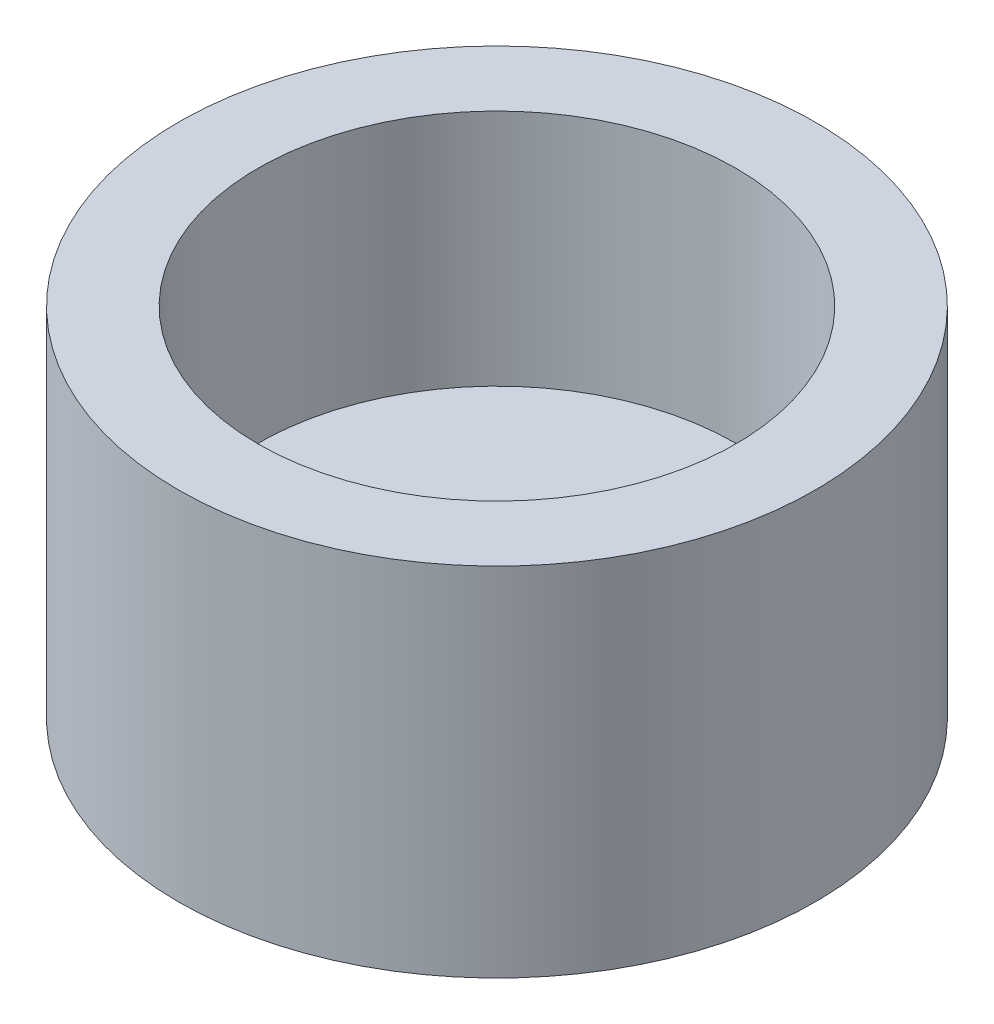
ISO-10303-21;
HEADER;
FILE_DESCRIPTION(('STEP AP214'),'2;1');
FILE_NAME('part.step','',(''),(''),'','','');
FILE_SCHEMA(('AUTOMOTIVE_DESIGN { 1 0 10303 214 1 1 1 1 }'));
ENDSEC;
DATA;
#1=APPLICATION_CONTEXT('core data for automotive mechanical design processes');
#2=APPLICATION_PROTOCOL_DEFINITION('international standard','automotive_design',2000,#1);
#3=PRODUCT_CONTEXT('',#1,'mechanical');
#4=PRODUCT('Part','Part','',(#3));
#5=PRODUCT_RELATED_PRODUCT_CATEGORY('part','',(#4));
#6=PRODUCT_DEFINITION_FORMATION('','',#4);
#7=PRODUCT_DEFINITION_CONTEXT('part definition',#1,'design');
#8=PRODUCT_DEFINITION('design','',#6,#7);
#9=PRODUCT_DEFINITION_SHAPE('','',#8);
#10=(LENGTH_UNIT() NAMED_UNIT(*) SI_UNIT(.MILLI.,.METRE.));
#11=(NAMED_UNIT(*) PLANE_ANGLE_UNIT() SI_UNIT($,.RADIAN.));
#12=(NAMED_UNIT(*) SI_UNIT($,.STERADIAN.) SOLID_ANGLE_UNIT());
#13=UNCERTAINTY_MEASURE_WITH_UNIT(LENGTH_MEASURE(1.E-05),#10,'distance_accuracy_value','');
#14=(GEOMETRIC_REPRESENTATION_CONTEXT(3) GLOBAL_UNCERTAINTY_ASSIGNED_CONTEXT((#13)) GLOBAL_UNIT_ASSIGNED_CONTEXT((#10,
#11,#12)) REPRESENTATION_CONTEXT('',''));
#15=CARTESIAN_POINT('',(0.,0.,0.));
#16=DIRECTION('',(0.,0.,1.));
#17=DIRECTION('',(1.,0.,0.));
#18=AXIS2_PLACEMENT_3D('',#15,#16,#17);
#19=CARTESIAN_POINT('',(0.,28.45,0.));
#20=DIRECTION('',(0.,-1.,0.));
#21=DIRECTION('',(0.,0.,-1.));
#22=AXIS2_PLACEMENT_3D('',#19,#20,#21);
#23=CYLINDRICAL_SURFACE('',#22,25.4);
#24=CARTESIAN_POINT('',(0.,28.45,0.));
#25=DIRECTION('',(0.,1.,0.));
#26=DIRECTION('',(0.,0.,1.));
#27=AXIS2_PLACEMENT_3D('',#24,#25,#26);
#28=CIRCLE('',#27,25.4);
#29=CARTESIAN_POINT('',(0.,28.45,25.4));
#30=VERTEX_POINT('',#29);
#31=EDGE_CURVE('E10',#30,#30,#28,.T.);
#32=ORIENTED_EDGE('',*,*,#31,.F.);
#33=EDGE_LOOP('',(#32));
#34=FACE_BOUND('',#33,.T.);
#35=CARTESIAN_POINT('',(0.,0.,0.));
#36=DIRECTION('',(0.,1.,0.));
#37=DIRECTION('',(0.,0.,1.));
#38=AXIS2_PLACEMENT_3D('',#35,#36,#37);
#39=CIRCLE('',#38,25.4);
#40=CARTESIAN_POINT('',(0.,0.,25.4));
#41=VERTEX_POINT('',#40);
#42=EDGE_CURVE('E40',#41,#41,#39,.T.);
#43=ORIENTED_EDGE('',*,*,#42,.T.);
#44=EDGE_LOOP('',(#43));
#45=FACE_BOUND('',#44,.T.);
#46=ADVANCED_FACE('F37',(#34,#45),#23,.T.);
#47=CARTESIAN_POINT('',(0.,28.45,0.));
#48=DIRECTION('',(0.,1.,0.));
#49=DIRECTION('',(0.,0.,1.));
#50=AXIS2_PLACEMENT_3D('',#47,#48,#49);
#51=PLANE('',#50);
#52=CARTESIAN_POINT('',(0.,28.45,0.));
#53=DIRECTION('',(0.,1.,0.));
#54=DIRECTION('',(0.,0.,1.));
#55=AXIS2_PLACEMENT_3D('',#52,#53,#54);
#56=CIRCLE('',#55,19.05);
#57=CARTESIAN_POINT('',(0.,28.45,19.05));
#58=VERTEX_POINT('',#57);
#59=EDGE_CURVE('E51',#58,#58,#56,.T.);
#60=ORIENTED_EDGE('',*,*,#59,.F.);
#61=EDGE_LOOP('',(#60));
#62=FACE_BOUND('',#61,.T.);
#63=ORIENTED_EDGE('',*,*,#31,.T.);
#64=EDGE_LOOP('',(#63));
#65=FACE_BOUND('',#64,.T.);
#66=ADVANCED_FACE('F68',(#62,#65),#51,.T.);
#67=CARTESIAN_POINT('',(0.,0.,0.));
#68=DIRECTION('',(0.,1.,0.));
#69=DIRECTION('',(0.,0.,1.));
#70=AXIS2_PLACEMENT_3D('',#67,#68,#69);
#71=PLANE('',#70);
#72=ORIENTED_EDGE('',*,*,#42,.F.);
#73=EDGE_LOOP('',(#72));
#74=FACE_BOUND('',#73,.T.);
#75=ADVANCED_FACE('F64',(#74),#71,.F.);
#76=CARTESIAN_POINT('',(0.,9.45,0.));
#77=DIRECTION('',(0.,1.,0.));
#78=DIRECTION('',(0.,0.,1.));
#79=AXIS2_PLACEMENT_3D('',#76,#77,#78);
#80=CYLINDRICAL_SURFACE('',#79,19.05);
#81=CARTESIAN_POINT('',(0.,9.45,0.));
#82=DIRECTION('',(0.,1.,0.));
#83=DIRECTION('',(0.,0.,1.));
#84=AXIS2_PLACEMENT_3D('',#81,#82,#83);
#85=CIRCLE('',#84,19.05);
#86=CARTESIAN_POINT('',(0.,9.45,19.05));
#87=VERTEX_POINT('',#86);
#88=EDGE_CURVE('E49',#87,#87,#85,.T.);
#89=ORIENTED_EDGE('',*,*,#88,.F.);
#90=EDGE_LOOP('',(#89));
#91=FACE_BOUND('',#90,.T.);
#92=ORIENTED_EDGE('',*,*,#59,.T.);
#93=EDGE_LOOP('',(#92));
#94=FACE_BOUND('',#93,.T.);
#95=ADVANCED_FACE('F61',(#91,#94),#80,.F.);
#96=CARTESIAN_POINT('',(0.,9.45,0.));
#97=DIRECTION('',(0.,1.,0.));
#98=DIRECTION('',(0.,0.,1.));
#99=AXIS2_PLACEMENT_3D('',#96,#97,#98);
#100=PLANE('',#99);
#101=ORIENTED_EDGE('',*,*,#88,.T.);
#102=EDGE_LOOP('',(#101));
#103=FACE_BOUND('',#102,.T.);
#104=ADVANCED_FACE('F59',(#103),#100,.T.);
#105=CLOSED_SHELL('',(#46,#66,#75,#95,#104));
#106=MANIFOLD_SOLID_BREP('B2',#105);
#107=ADVANCED_BREP_SHAPE_REPRESENTATION('',(#18,#106),#14);
#108=SHAPE_DEFINITION_REPRESENTATION(#9,#107);
ENDSEC;
END-ISO-10303-21;
